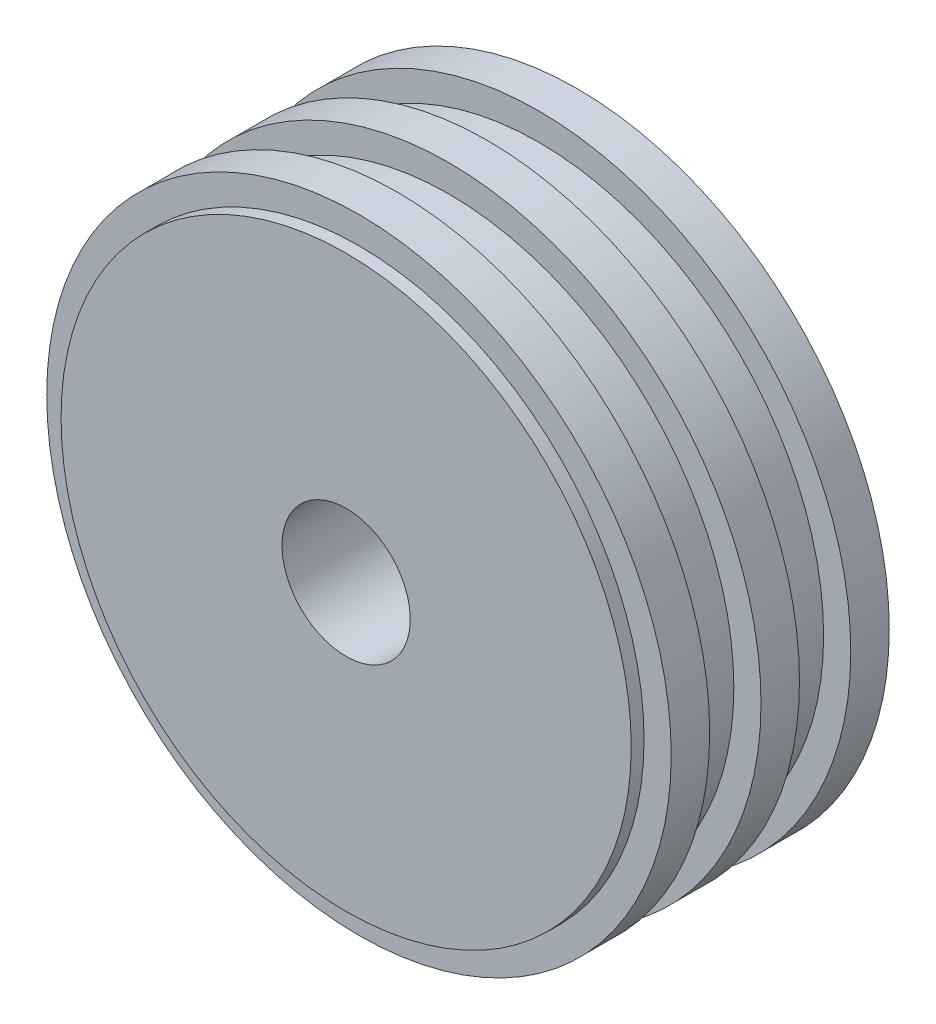
ISO-10303-21;
HEADER;
FILE_DESCRIPTION(('STEP AP214'),'2;1');
FILE_NAME('part.step','',(''),(''),'','','');
FILE_SCHEMA(('AUTOMOTIVE_DESIGN { 1 0 10303 214 1 1 1 1 }'));
ENDSEC;
DATA;
#1=APPLICATION_CONTEXT('core data for automotive mechanical design processes');
#2=APPLICATION_PROTOCOL_DEFINITION('international standard','automotive_design',2000,#1);
#3=PRODUCT_CONTEXT('',#1,'mechanical');
#4=PRODUCT('Part','Part','',(#3));
#5=PRODUCT_RELATED_PRODUCT_CATEGORY('part','',(#4));
#6=PRODUCT_DEFINITION_FORMATION('','',#4);
#7=PRODUCT_DEFINITION_CONTEXT('part definition',#1,'design');
#8=PRODUCT_DEFINITION('design','',#6,#7);
#9=PRODUCT_DEFINITION_SHAPE('','',#8);
#10=(LENGTH_UNIT() NAMED_UNIT(*) SI_UNIT(.MILLI.,.METRE.));
#11=(NAMED_UNIT(*) PLANE_ANGLE_UNIT() SI_UNIT($,.RADIAN.));
#12=(NAMED_UNIT(*) SI_UNIT($,.STERADIAN.) SOLID_ANGLE_UNIT());
#13=UNCERTAINTY_MEASURE_WITH_UNIT(LENGTH_MEASURE(1.E-05),#10,'distance_accuracy_value','');
#14=(GEOMETRIC_REPRESENTATION_CONTEXT(3) GLOBAL_UNCERTAINTY_ASSIGNED_CONTEXT((#13)) GLOBAL_UNIT_ASSIGNED_CONTEXT((#10,
#11,#12)) REPRESENTATION_CONTEXT('',''));
#15=CARTESIAN_POINT('',(0.,0.,0.));
#16=DIRECTION('',(0.,0.,1.));
#17=DIRECTION('',(1.,0.,0.));
#18=AXIS2_PLACEMENT_3D('',#15,#16,#17);
#19=CARTESIAN_POINT('',(0.,0.,57.));
#20=DIRECTION('',(0.,0.,-1.));
#21=DIRECTION('',(-1.,0.,0.));
#22=AXIS2_PLACEMENT_3D('',#19,#20,#21);
#23=CYLINDRICAL_SURFACE('',#22,66.675);
#24=CARTESIAN_POINT('',(0.,0.,24.));
#25=DIRECTION('',(0.,0.,-1.));
#26=DIRECTION('',(-1.,0.,0.));
#27=AXIS2_PLACEMENT_3D('',#24,#25,#26);
#28=CIRCLE('',#27,66.675);
#29=CARTESIAN_POINT('',(-66.675,0.,24.));
#30=VERTEX_POINT('',#29);
#31=EDGE_CURVE('E61',#30,#30,#28,.T.);
#32=CARTESIAN_POINT('',(0.,0.,12.));
#33=DIRECTION('',(0.,0.,-1.));
#34=DIRECTION('',(-1.,0.,0.));
#35=AXIS2_PLACEMENT_3D('',#32,#33,#34);
#36=CIRCLE('',#35,66.675);
#37=CARTESIAN_POINT('',(-66.675,0.,12.));
#38=VERTEX_POINT('',#37);
#39=EDGE_CURVE('E52',#38,#38,#36,.T.);
#40=CARTESIAN_POINT('',(-66.675,0.,24.));
#41=CARTESIAN_POINT('',(-66.675,0.,23.875));
#42=CARTESIAN_POINT('',(-66.675,0.,23.75));
#43=CARTESIAN_POINT('',(-66.675,0.,23.5));
#44=CARTESIAN_POINT('',(-66.675,0.,23.375));
#45=CARTESIAN_POINT('',(-66.675,0.,23.125));
#46=CARTESIAN_POINT('',(-66.675,0.,23.));
#47=CARTESIAN_POINT('',(-66.675,0.,22.75));
#48=CARTESIAN_POINT('',(-66.675,0.,22.625));
#49=CARTESIAN_POINT('',(-66.675,0.,22.375));
#50=CARTESIAN_POINT('',(-66.675,0.,22.25));
#51=CARTESIAN_POINT('',(-66.675,0.,22.));
#52=CARTESIAN_POINT('',(-66.675,0.,21.875));
#53=CARTESIAN_POINT('',(-66.675,0.,21.625));
#54=CARTESIAN_POINT('',(-66.675,0.,21.5));
#55=CARTESIAN_POINT('',(-66.675,0.,21.25));
#56=CARTESIAN_POINT('',(-66.675,0.,21.125));
#57=CARTESIAN_POINT('',(-66.675,0.,20.875));
#58=CARTESIAN_POINT('',(-66.675,0.,20.75));
#59=CARTESIAN_POINT('',(-66.675,0.,20.5));
#60=CARTESIAN_POINT('',(-66.675,0.,20.375));
#61=CARTESIAN_POINT('',(-66.675,0.,20.125));
#62=CARTESIAN_POINT('',(-66.675,0.,20.));
#63=CARTESIAN_POINT('',(-66.675,0.,19.75));
#64=CARTESIAN_POINT('',(-66.675,0.,19.625));
#65=CARTESIAN_POINT('',(-66.675,0.,19.375));
#66=CARTESIAN_POINT('',(-66.675,0.,19.25));
#67=CARTESIAN_POINT('',(-66.675,0.,19.));
#68=CARTESIAN_POINT('',(-66.675,0.,18.875));
#69=CARTESIAN_POINT('',(-66.675,0.,18.625));
#70=CARTESIAN_POINT('',(-66.675,0.,18.5));
#71=CARTESIAN_POINT('',(-66.675,0.,18.25));
#72=CARTESIAN_POINT('',(-66.675,0.,18.125));
#73=CARTESIAN_POINT('',(-66.675,0.,17.875));
#74=CARTESIAN_POINT('',(-66.675,0.,17.75));
#75=CARTESIAN_POINT('',(-66.675,0.,17.5));
#76=CARTESIAN_POINT('',(-66.675,0.,17.375));
#77=CARTESIAN_POINT('',(-66.675,0.,17.125));
#78=CARTESIAN_POINT('',(-66.675,0.,17.));
#79=CARTESIAN_POINT('',(-66.675,0.,16.75));
#80=CARTESIAN_POINT('',(-66.675,0.,16.625));
#81=CARTESIAN_POINT('',(-66.675,0.,16.375));
#82=CARTESIAN_POINT('',(-66.675,0.,16.25));
#83=CARTESIAN_POINT('',(-66.675,0.,16.));
#84=CARTESIAN_POINT('',(-66.675,0.,15.875));
#85=CARTESIAN_POINT('',(-66.675,0.,15.625));
#86=CARTESIAN_POINT('',(-66.675,0.,15.5));
#87=CARTESIAN_POINT('',(-66.675,0.,15.25));
#88=CARTESIAN_POINT('',(-66.675,0.,15.125));
#89=CARTESIAN_POINT('',(-66.675,0.,14.875));
#90=CARTESIAN_POINT('',(-66.675,0.,14.75));
#91=CARTESIAN_POINT('',(-66.675,0.,14.5));
#92=CARTESIAN_POINT('',(-66.675,0.,14.375));
#93=CARTESIAN_POINT('',(-66.675,0.,14.125));
#94=CARTESIAN_POINT('',(-66.675,0.,14.));
#95=CARTESIAN_POINT('',(-66.675,0.,13.75));
#96=CARTESIAN_POINT('',(-66.675,0.,13.625));
#97=CARTESIAN_POINT('',(-66.675,0.,13.375));
#98=CARTESIAN_POINT('',(-66.675,0.,13.25));
#99=CARTESIAN_POINT('',(-66.675,0.,13.));
#100=CARTESIAN_POINT('',(-66.675,0.,12.875));
#101=CARTESIAN_POINT('',(-66.675,0.,12.625));
#102=CARTESIAN_POINT('',(-66.675,0.,12.5));
#103=CARTESIAN_POINT('',(-66.675,0.,12.25));
#104=CARTESIAN_POINT('',(-66.675,0.,12.125));
#105=CARTESIAN_POINT('',(-66.675,0.,12.));
#106=B_SPLINE_CURVE_WITH_KNOTS('',3,(#40,#41,#42,#43,#44,#45,#46,#47,#48,#49,#50,#51,#52,#53,
#54,#55,#56,#57,#58,#59,#60,#61,#62,#63,#64,#65,#66,#67,#68,#69,#70,#71,#72,#73,#74,#75,#76,#77,
#78,#79,#80,#81,#82,#83,#84,#85,#86,#87,#88,#89,#90,#91,#92,#93,#94,#95,#96,#97,#98,#99,#100,
#101,#102,#103,#104,#105),.UNSPECIFIED.,.F.,.F.,(4,2,2,2,2,2,2,2,2,2,2,2,2,2,2,2,2,2,2,2,2,2,2,
2,2,2,2,2,2,2,2,2,4),(0.,0.375,0.750000000000001,1.125,1.5,1.875,2.25,2.625,3.,3.375,3.75,4.125,
4.5,4.875,5.25,5.625,6.,6.375,6.75,7.125,7.5,7.875,8.24999999999999,8.62499999999999,
8.99999999999999,9.37499999999999,9.74999999999999,10.125,10.5,10.875,11.25,11.625,12.),.UNSPECIFIED.);
#107=EDGE_CURVE('BSEAM39',#30,#38,#106,.T.);
#108=ORIENTED_EDGE('',*,*,#31,.T.);
#109=ORIENTED_EDGE('',*,*,#39,.F.);
#110=ORIENTED_EDGE('',*,*,#107,.T.);
#111=ORIENTED_EDGE('',*,*,#107,.F.);
#112=EDGE_LOOP('',(#108,#110,#109,#111));
#113=FACE_BOUND('',#112,.T.);
#114=ADVANCED_FACE('F39',(#113),#23,.T.);
#115=CARTESIAN_POINT('',(0.,0.,12.));
#116=DIRECTION('',(0.,0.,-1.));
#117=DIRECTION('',(-1.,0.,0.));
#118=AXIS2_PLACEMENT_3D('',#115,#116,#117);
#119=CYLINDRICAL_SURFACE('',#118,73.025);
#120=CARTESIAN_POINT('',(0.,0.,12.));
#121=DIRECTION('',(0.,0.,-1.));
#122=DIRECTION('',(-1.,0.,0.));
#123=AXIS2_PLACEMENT_3D('',#120,#121,#122);
#124=CIRCLE('',#123,73.025);
#125=CARTESIAN_POINT('',(-73.025,0.,12.));
#126=VERTEX_POINT('',#125);
#127=EDGE_CURVE('E68',#126,#126,#124,.T.);
#128=ORIENTED_EDGE('',*,*,#127,.T.);
#129=EDGE_LOOP('',(#128));
#130=FACE_BOUND('',#129,.T.);
#131=CARTESIAN_POINT('',(0.,0.,3.));
#132=DIRECTION('',(0.,0.,-1.));
#133=DIRECTION('',(-1.,0.,0.));
#134=AXIS2_PLACEMENT_3D('',#131,#132,#133);
#135=CIRCLE('',#134,73.025);
#136=CARTESIAN_POINT('',(-73.025,0.,3.));
#137=VERTEX_POINT('',#136);
#138=EDGE_CURVE('E66',#137,#137,#135,.T.);
#139=ORIENTED_EDGE('',*,*,#138,.F.);
#140=EDGE_LOOP('',(#139));
#141=FACE_BOUND('',#140,.T.);
#142=ADVANCED_FACE('F114',(#130,#141),#119,.T.);
#143=CARTESIAN_POINT('',(0.,0.,12.));
#144=DIRECTION('',(0.,0.,-1.));
#145=DIRECTION('',(-1.,0.,0.));
#146=AXIS2_PLACEMENT_3D('',#143,#144,#145);
#147=PLANE('',#146);
#148=ORIENTED_EDGE('',*,*,#39,.T.);
#149=EDGE_LOOP('',(#148));
#150=FACE_BOUND('',#149,.T.);
#151=ORIENTED_EDGE('',*,*,#127,.F.);
#152=EDGE_LOOP('',(#151));
#153=FACE_BOUND('',#152,.T.);
#154=ADVANCED_FACE('F119',(#150,#153),#147,.F.);
#155=CARTESIAN_POINT('',(0.,0.,3.));
#156=DIRECTION('',(0.,0.,-1.));
#157=DIRECTION('',(-1.,0.,0.));
#158=AXIS2_PLACEMENT_3D('',#155,#156,#157);
#159=PLANE('',#158);
#160=CARTESIAN_POINT('',(0.,0.,3.));
#161=DIRECTION('',(0.,0.,-1.));
#162=DIRECTION('',(-1.,0.,0.));
#163=AXIS2_PLACEMENT_3D('',#160,#161,#162);
#164=CIRCLE('',#163,66.675);
#165=CARTESIAN_POINT('',(-66.675,0.,3.));
#166=VERTEX_POINT('',#165);
#167=EDGE_CURVE('E71',#166,#166,#164,.T.);
#168=ORIENTED_EDGE('',*,*,#167,.F.);
#169=EDGE_LOOP('',(#168));
#170=FACE_BOUND('',#169,.T.);
#171=ORIENTED_EDGE('',*,*,#138,.T.);
#172=EDGE_LOOP('',(#171));
#173=FACE_BOUND('',#172,.T.);
#174=ADVANCED_FACE('F124',(#170,#173),#159,.T.);
#175=CARTESIAN_POINT('',(0.,0.,0.));
#176=DIRECTION('',(0.,0.,1.));
#177=DIRECTION('',(1.,0.,0.));
#178=AXIS2_PLACEMENT_3D('',#175,#176,#177);
#179=CIRCLE('',#178,66.675);
#180=CARTESIAN_POINT('',(-66.675,0.,0.));
#181=VERTEX_POINT('',#180);
#182=EDGE_CURVE('E43',#181,#181,#179,.T.);
#183=CARTESIAN_POINT('',(-66.675,0.,3.));
#184=CARTESIAN_POINT('',(-66.675,0.,2.96875));
#185=CARTESIAN_POINT('',(-66.675,0.,2.9375));
#186=CARTESIAN_POINT('',(-66.675,0.,2.875));
#187=CARTESIAN_POINT('',(-66.675,0.,2.84375));
#188=CARTESIAN_POINT('',(-66.675,0.,2.78125));
#189=CARTESIAN_POINT('',(-66.675,0.,2.75));
#190=CARTESIAN_POINT('',(-66.675,0.,2.6875));
#191=CARTESIAN_POINT('',(-66.675,0.,2.65625));
#192=CARTESIAN_POINT('',(-66.675,0.,2.59375));
#193=CARTESIAN_POINT('',(-66.675,0.,2.5625));
#194=CARTESIAN_POINT('',(-66.675,0.,2.5));
#195=CARTESIAN_POINT('',(-66.675,0.,2.46875));
#196=CARTESIAN_POINT('',(-66.675,0.,2.40625));
#197=CARTESIAN_POINT('',(-66.675,0.,2.375));
#198=CARTESIAN_POINT('',(-66.675,0.,2.3125));
#199=CARTESIAN_POINT('',(-66.675,0.,2.28125));
#200=CARTESIAN_POINT('',(-66.675,0.,2.21875));
#201=CARTESIAN_POINT('',(-66.675,0.,2.1875));
#202=CARTESIAN_POINT('',(-66.675,0.,2.125));
#203=CARTESIAN_POINT('',(-66.675,0.,2.09375));
#204=CARTESIAN_POINT('',(-66.675,0.,2.03125));
#205=CARTESIAN_POINT('',(-66.675,0.,2.));
#206=CARTESIAN_POINT('',(-66.675,0.,1.9375));
#207=CARTESIAN_POINT('',(-66.675,0.,1.90625));
#208=CARTESIAN_POINT('',(-66.675,0.,1.84375));
#209=CARTESIAN_POINT('',(-66.675,0.,1.8125));
#210=CARTESIAN_POINT('',(-66.675,0.,1.75));
#211=CARTESIAN_POINT('',(-66.675,0.,1.71875));
#212=CARTESIAN_POINT('',(-66.675,0.,1.65625));
#213=CARTESIAN_POINT('',(-66.675,0.,1.625));
#214=CARTESIAN_POINT('',(-66.675,0.,1.5625));
#215=CARTESIAN_POINT('',(-66.675,0.,1.53125));
#216=CARTESIAN_POINT('',(-66.675,0.,1.46875));
#217=CARTESIAN_POINT('',(-66.675,0.,1.4375));
#218=CARTESIAN_POINT('',(-66.675,0.,1.375));
#219=CARTESIAN_POINT('',(-66.675,0.,1.34375));
#220=CARTESIAN_POINT('',(-66.675,0.,1.28125));
#221=CARTESIAN_POINT('',(-66.675,0.,1.25));
#222=CARTESIAN_POINT('',(-66.675,0.,1.1875));
#223=CARTESIAN_POINT('',(-66.675,0.,1.15625));
#224=CARTESIAN_POINT('',(-66.675,0.,1.09375));
#225=CARTESIAN_POINT('',(-66.675,0.,1.0625));
#226=CARTESIAN_POINT('',(-66.675,0.,0.999999999999999));
#227=CARTESIAN_POINT('',(-66.675,0.,0.96875));
#228=CARTESIAN_POINT('',(-66.675,0.,0.906250000000002));
#229=CARTESIAN_POINT('',(-66.675,0.,0.875000000000003));
#230=CARTESIAN_POINT('',(-66.675,0.,0.812500000000003));
#231=CARTESIAN_POINT('',(-66.675,0.,0.781250000000002));
#232=CARTESIAN_POINT('',(-66.675,0.,0.718749999999999));
#233=CARTESIAN_POINT('',(-66.675,0.,0.687499999999998));
#234=CARTESIAN_POINT('',(-66.675,0.,0.624999999999998));
#235=CARTESIAN_POINT('',(-66.675,0.,0.593749999999999));
#236=CARTESIAN_POINT('',(-66.675,0.,0.531250000000002));
#237=CARTESIAN_POINT('',(-66.675,0.,0.500000000000003));
#238=CARTESIAN_POINT('',(-66.675,0.,0.437500000000003));
#239=CARTESIAN_POINT('',(-66.675,0.,0.406250000000002));
#240=CARTESIAN_POINT('',(-66.675,0.,0.343749999999999));
#241=CARTESIAN_POINT('',(-66.675,0.,0.312499999999998));
#242=CARTESIAN_POINT('',(-66.675,0.,0.249999999999998));
#243=CARTESIAN_POINT('',(-66.675,0.,0.218749999999999));
#244=CARTESIAN_POINT('',(-66.675,0.,0.156250000000001));
#245=CARTESIAN_POINT('',(-66.675,0.,0.125000000000002));
#246=CARTESIAN_POINT('',(-66.675,0.,0.0625000000000024));
#247=CARTESIAN_POINT('',(-66.675,0.,0.0312500000000012));
#248=CARTESIAN_POINT('',(-66.675,0.,0.));
#249=B_SPLINE_CURVE_WITH_KNOTS('',3,(#183,#184,#185,#186,#187,#188,#189,#190,#191,#192,#193,
#194,#195,#196,#197,#198,#199,#200,#201,#202,#203,#204,#205,#206,#207,#208,#209,#210,#211,#212,
#213,#214,#215,#216,#217,#218,#219,#220,#221,#222,#223,#224,#225,#226,#227,#228,#229,#230,#231,
#232,#233,#234,#235,#236,#237,#238,#239,#240,#241,#242,#243,#244,#245,#246,#247,#248),
.UNSPECIFIED.,.F.,.F.,(4,2,2,2,2,2,2,2,2,2,2,2,2,2,2,2,2,2,2,2,2,2,2,2,2,2,2,2,2,2,2,2,4),(0.,
0.0937500000000036,0.1875,0.281249999999997,0.375,0.468750000000004,0.5625,0.656249999999997,
0.750000000000001,0.843750000000004,0.937500000000001,1.03125,1.125,1.21875,1.3125,1.40625,1.5,
1.59375,1.6875,1.78125,1.875,1.96875000000001,2.0625,2.15625,2.25,2.34375000000001,2.4375,
2.53125,2.625,2.71875000000001,2.8125,2.90625,3.),.UNSPECIFIED.);
#250=EDGE_CURVE('BSEAM41',#166,#181,#249,.T.);
#251=ORIENTED_EDGE('',*,*,#167,.T.);
#252=ORIENTED_EDGE('',*,*,#182,.T.);
#253=ORIENTED_EDGE('',*,*,#250,.T.);
#254=ORIENTED_EDGE('',*,*,#250,.F.);
#255=EDGE_LOOP('',(#251,#253,#252,#254));
#256=FACE_BOUND('',#255,.T.);
#257=ADVANCED_FACE('F41',(#256),#23,.T.);
#258=CARTESIAN_POINT('',(0.,0.,0.));
#259=DIRECTION('',(0.,0.,1.));
#260=DIRECTION('',(1.,0.,0.));
#261=AXIS2_PLACEMENT_3D('',#258,#259,#260);
#262=PLANE('',#261);
#263=ORIENTED_EDGE('',*,*,#182,.F.);
#264=EDGE_LOOP('',(#263));
#265=FACE_BOUND('',#264,.T.);
#266=CARTESIAN_POINT('',(0.,0.,0.));
#267=DIRECTION('',(0.,0.,1.));
#268=DIRECTION('',(1.,0.,0.));
#269=AXIS2_PLACEMENT_3D('',#266,#267,#268);
#270=CIRCLE('',#269,15.);
#271=CARTESIAN_POINT('',(-15.,0.,0.));
#272=VERTEX_POINT('',#271);
#273=EDGE_CURVE('E76',#272,#272,#270,.T.);
#274=ORIENTED_EDGE('',*,*,#273,.T.);
#275=EDGE_LOOP('',(#274));
#276=FACE_BOUND('',#275,.T.);
#277=ADVANCED_FACE('F91',(#265,#276),#262,.F.);
#278=CARTESIAN_POINT('',(0.,0.,57.));
#279=DIRECTION('',(0.,0.,-1.));
#280=DIRECTION('',(-1.,0.,0.));
#281=AXIS2_PLACEMENT_3D('',#278,#279,#280);
#282=CYLINDRICAL_SURFACE('',#281,15.);
#283=CARTESIAN_POINT('',(0.,0.,57.));
#284=DIRECTION('',(0.,0.,1.));
#285=DIRECTION('',(1.,0.,0.));
#286=AXIS2_PLACEMENT_3D('',#283,#284,#285);
#287=CIRCLE('',#286,15.);
#288=CARTESIAN_POINT('',(-15.,0.,57.));
#289=VERTEX_POINT('',#288);
#290=EDGE_CURVE('E80',#289,#289,#287,.T.);
#291=CARTESIAN_POINT('',(-15.,0.,0.));
#292=CARTESIAN_POINT('',(-15.,0.,0.593749999999999));
#293=CARTESIAN_POINT('',(-15.,0.,1.1875));
#294=CARTESIAN_POINT('',(-15.,0.,2.375));
#295=CARTESIAN_POINT('',(-15.,0.,2.96875));
#296=CARTESIAN_POINT('',(-15.,0.,4.15625));
#297=CARTESIAN_POINT('',(-15.,0.,4.75));
#298=CARTESIAN_POINT('',(-15.,0.,5.9375));
#299=CARTESIAN_POINT('',(-15.,0.,6.53125));
#300=CARTESIAN_POINT('',(-15.,0.,7.71875));
#301=CARTESIAN_POINT('',(-15.,0.,8.3125));
#302=CARTESIAN_POINT('',(-15.,0.,9.5));
#303=CARTESIAN_POINT('',(-15.,0.,10.09375));
#304=CARTESIAN_POINT('',(-15.,0.,11.28125));
#305=CARTESIAN_POINT('',(-15.,0.,11.875));
#306=CARTESIAN_POINT('',(-15.,0.,13.0625));
#307=CARTESIAN_POINT('',(-15.,0.,13.65625));
#308=CARTESIAN_POINT('',(-15.,0.,14.84375));
#309=CARTESIAN_POINT('',(-15.,0.,15.4375));
#310=CARTESIAN_POINT('',(-15.,0.,16.625));
#311=CARTESIAN_POINT('',(-15.,0.,17.21875));
#312=CARTESIAN_POINT('',(-15.,0.,18.40625));
#313=CARTESIAN_POINT('',(-15.,0.,19.));
#314=CARTESIAN_POINT('',(-15.,0.,20.1875));
#315=CARTESIAN_POINT('',(-15.,0.,20.78125));
#316=CARTESIAN_POINT('',(-15.,0.,21.96875));
#317=CARTESIAN_POINT('',(-15.,0.,22.5625));
#318=CARTESIAN_POINT('',(-15.,0.,23.75));
#319=CARTESIAN_POINT('',(-15.,0.,24.34375));
#320=CARTESIAN_POINT('',(-15.,0.,25.53125));
#321=CARTESIAN_POINT('',(-15.,0.,26.125));
#322=CARTESIAN_POINT('',(-15.,0.,27.3125));
#323=CARTESIAN_POINT('',(-15.,0.,27.90625));
#324=CARTESIAN_POINT('',(-15.,0.,29.09375));
#325=CARTESIAN_POINT('',(-15.,0.,29.6875));
#326=CARTESIAN_POINT('',(-15.,0.,30.875));
#327=CARTESIAN_POINT('',(-15.,0.,31.46875));
#328=CARTESIAN_POINT('',(-15.,0.,32.65625));
#329=CARTESIAN_POINT('',(-15.,0.,33.25));
#330=CARTESIAN_POINT('',(-15.,0.,34.4375));
#331=CARTESIAN_POINT('',(-15.,0.,35.03125));
#332=CARTESIAN_POINT('',(-15.,0.,36.21875));
#333=CARTESIAN_POINT('',(-15.,0.,36.8125));
#334=CARTESIAN_POINT('',(-15.,0.,38.));
#335=CARTESIAN_POINT('',(-15.,0.,38.59375));
#336=CARTESIAN_POINT('',(-15.,0.,39.78125));
#337=CARTESIAN_POINT('',(-15.,0.,40.375));
#338=CARTESIAN_POINT('',(-15.,0.,41.5625));
#339=CARTESIAN_POINT('',(-15.,0.,42.15625));
#340=CARTESIAN_POINT('',(-15.,0.,43.34375));
#341=CARTESIAN_POINT('',(-15.,0.,43.9375));
#342=CARTESIAN_POINT('',(-15.,0.,45.125));
#343=CARTESIAN_POINT('',(-15.,0.,45.71875));
#344=CARTESIAN_POINT('',(-15.,0.,46.90625));
#345=CARTESIAN_POINT('',(-15.,0.,47.5));
#346=CARTESIAN_POINT('',(-15.,0.,48.6875));
#347=CARTESIAN_POINT('',(-15.,0.,49.28125));
#348=CARTESIAN_POINT('',(-15.,0.,50.46875));
#349=CARTESIAN_POINT('',(-15.,0.,51.0625));
#350=CARTESIAN_POINT('',(-15.,0.,52.25));
#351=CARTESIAN_POINT('',(-15.,0.,52.84375));
#352=CARTESIAN_POINT('',(-15.,0.,54.03125));
#353=CARTESIAN_POINT('',(-15.,0.,54.625));
#354=CARTESIAN_POINT('',(-15.,0.,55.8125));
#355=CARTESIAN_POINT('',(-15.,0.,56.40625));
#356=CARTESIAN_POINT('',(-15.,0.,57.));
#357=B_SPLINE_CURVE_WITH_KNOTS('',3,(#291,#292,#293,#294,#295,#296,#297,#298,#299,#300,#301,
#302,#303,#304,#305,#306,#307,#308,#309,#310,#311,#312,#313,#314,#315,#316,#317,#318,#319,#320,
#321,#322,#323,#324,#325,#326,#327,#328,#329,#330,#331,#332,#333,#334,#335,#336,#337,#338,#339,
#340,#341,#342,#343,#344,#345,#346,#347,#348,#349,#350,#351,#352,#353,#354,#355,#356),
.UNSPECIFIED.,.F.,.F.,(4,2,2,2,2,2,2,2,2,2,2,2,2,2,2,2,2,2,2,2,2,2,2,2,2,2,2,2,2,2,2,2,4),(0.,
1.78125,3.5625,5.34375,7.125,8.90625,10.6875,12.46875,14.25,16.03125,17.8125,19.59375,21.375,
23.15625,24.9375,26.71875,28.5,30.28125,32.0625,33.84375,35.625,37.40625,39.1875,40.96875,42.75,
44.53125,46.3125,48.09375,49.875,51.65625,53.4375,55.21875,57.),.UNSPECIFIED.);
#358=EDGE_CURVE('BSEAM94',#272,#289,#357,.T.);
#359=ORIENTED_EDGE('',*,*,#273,.F.);
#360=ORIENTED_EDGE('',*,*,#290,.T.);
#361=ORIENTED_EDGE('',*,*,#358,.T.);
#362=ORIENTED_EDGE('',*,*,#358,.F.);
#363=EDGE_LOOP('',(#359,#361,#360,#362));
#364=FACE_BOUND('',#363,.T.);
#365=ADVANCED_FACE('F94',(#364),#282,.F.);
#366=CARTESIAN_POINT('',(0.,0.,33.));
#367=DIRECTION('',(0.,0.,-1.));
#368=DIRECTION('',(-1.,0.,0.));
#369=AXIS2_PLACEMENT_3D('',#366,#367,#368);
#370=CYLINDRICAL_SURFACE('',#369,73.025);
#371=CARTESIAN_POINT('',(0.,0.,33.));
#372=DIRECTION('',(0.,0.,-1.));
#373=DIRECTION('',(-1.,0.,0.));
#374=AXIS2_PLACEMENT_3D('',#371,#372,#373);
#375=CIRCLE('',#374,73.025);
#376=CARTESIAN_POINT('',(-73.025,0.,33.));
#377=VERTEX_POINT('',#376);
#378=EDGE_CURVE('E58',#377,#377,#375,.T.);
#379=ORIENTED_EDGE('',*,*,#378,.T.);
#380=EDGE_LOOP('',(#379));
#381=FACE_BOUND('',#380,.T.);
#382=CARTESIAN_POINT('',(0.,0.,24.));
#383=DIRECTION('',(0.,0.,-1.));
#384=DIRECTION('',(-1.,0.,0.));
#385=AXIS2_PLACEMENT_3D('',#382,#383,#384);
#386=CIRCLE('',#385,73.025);
#387=CARTESIAN_POINT('',(-73.025,0.,24.));
#388=VERTEX_POINT('',#387);
#389=EDGE_CURVE('E62',#388,#388,#386,.T.);
#390=ORIENTED_EDGE('',*,*,#389,.F.);
#391=EDGE_LOOP('',(#390));
#392=FACE_BOUND('',#391,.T.);
#393=ADVANCED_FACE('F99',(#381,#392),#370,.T.);
#394=CARTESIAN_POINT('',(0.,0.,33.));
#395=DIRECTION('',(0.,0.,-1.));
#396=DIRECTION('',(-1.,0.,0.));
#397=AXIS2_PLACEMENT_3D('',#394,#395,#396);
#398=PLANE('',#397);
#399=CARTESIAN_POINT('',(0.,0.,33.));
#400=DIRECTION('',(0.,0.,-1.));
#401=DIRECTION('',(-1.,0.,0.));
#402=AXIS2_PLACEMENT_3D('',#399,#400,#401);
#403=CIRCLE('',#402,66.675);
#404=CARTESIAN_POINT('',(-66.675,0.,33.));
#405=VERTEX_POINT('',#404);
#406=EDGE_CURVE('E47',#405,#405,#403,.T.);
#407=ORIENTED_EDGE('',*,*,#406,.T.);
#408=EDGE_LOOP('',(#407));
#409=FACE_BOUND('',#408,.T.);
#410=ORIENTED_EDGE('',*,*,#378,.F.);
#411=EDGE_LOOP('',(#410));
#412=FACE_BOUND('',#411,.T.);
#413=ADVANCED_FACE('F137',(#409,#412),#398,.F.);
#414=CARTESIAN_POINT('',(0.,0.,24.));
#415=DIRECTION('',(0.,0.,-1.));
#416=DIRECTION('',(-1.,0.,0.));
#417=AXIS2_PLACEMENT_3D('',#414,#415,#416);
#418=PLANE('',#417);
#419=ORIENTED_EDGE('',*,*,#31,.F.);
#420=EDGE_LOOP('',(#419));
#421=FACE_BOUND('',#420,.T.);
#422=ORIENTED_EDGE('',*,*,#389,.T.);
#423=EDGE_LOOP('',(#422));
#424=FACE_BOUND('',#423,.T.);
#425=ADVANCED_FACE('F128',(#421,#424),#418,.T.);
#426=CARTESIAN_POINT('',(0.,0.,45.));
#427=DIRECTION('',(0.,0.,-1.));
#428=DIRECTION('',(-1.,0.,0.));
#429=AXIS2_PLACEMENT_3D('',#426,#427,#428);
#430=CIRCLE('',#429,66.675);
#431=CARTESIAN_POINT('',(-66.675,0.,45.));
#432=VERTEX_POINT('',#431);
#433=EDGE_CURVE('E56',#432,#432,#430,.T.);
#434=CARTESIAN_POINT('',(-66.675,0.,45.));
#435=CARTESIAN_POINT('',(-66.675,0.,44.875));
#436=CARTESIAN_POINT('',(-66.675,0.,44.75));
#437=CARTESIAN_POINT('',(-66.675,0.,44.5));
#438=CARTESIAN_POINT('',(-66.675,0.,44.375));
#439=CARTESIAN_POINT('',(-66.675,0.,44.125));
#440=CARTESIAN_POINT('',(-66.675,0.,44.));
#441=CARTESIAN_POINT('',(-66.675,0.,43.75));
#442=CARTESIAN_POINT('',(-66.675,0.,43.625));
#443=CARTESIAN_POINT('',(-66.675,0.,43.375));
#444=CARTESIAN_POINT('',(-66.675,0.,43.25));
#445=CARTESIAN_POINT('',(-66.675,0.,43.));
#446=CARTESIAN_POINT('',(-66.675,0.,42.875));
#447=CARTESIAN_POINT('',(-66.675,0.,42.625));
#448=CARTESIAN_POINT('',(-66.675,0.,42.5));
#449=CARTESIAN_POINT('',(-66.675,0.,42.25));
#450=CARTESIAN_POINT('',(-66.675,0.,42.125));
#451=CARTESIAN_POINT('',(-66.675,0.,41.875));
#452=CARTESIAN_POINT('',(-66.675,0.,41.75));
#453=CARTESIAN_POINT('',(-66.675,0.,41.5));
#454=CARTESIAN_POINT('',(-66.675,0.,41.375));
#455=CARTESIAN_POINT('',(-66.675,0.,41.125));
#456=CARTESIAN_POINT('',(-66.675,0.,41.));
#457=CARTESIAN_POINT('',(-66.675,0.,40.75));
#458=CARTESIAN_POINT('',(-66.675,0.,40.625));
#459=CARTESIAN_POINT('',(-66.675,0.,40.375));
#460=CARTESIAN_POINT('',(-66.675,0.,40.25));
#461=CARTESIAN_POINT('',(-66.675,0.,40.));
#462=CARTESIAN_POINT('',(-66.675,0.,39.875));
#463=CARTESIAN_POINT('',(-66.675,0.,39.625));
#464=CARTESIAN_POINT('',(-66.675,0.,39.5));
#465=CARTESIAN_POINT('',(-66.675,0.,39.25));
#466=CARTESIAN_POINT('',(-66.675,0.,39.125));
#467=CARTESIAN_POINT('',(-66.675,0.,38.875));
#468=CARTESIAN_POINT('',(-66.675,0.,38.75));
#469=CARTESIAN_POINT('',(-66.675,0.,38.5));
#470=CARTESIAN_POINT('',(-66.675,0.,38.375));
#471=CARTESIAN_POINT('',(-66.675,0.,38.125));
#472=CARTESIAN_POINT('',(-66.675,0.,38.));
#473=CARTESIAN_POINT('',(-66.675,0.,37.75));
#474=CARTESIAN_POINT('',(-66.675,0.,37.625));
#475=CARTESIAN_POINT('',(-66.675,0.,37.375));
#476=CARTESIAN_POINT('',(-66.675,0.,37.25));
#477=CARTESIAN_POINT('',(-66.675,0.,37.));
#478=CARTESIAN_POINT('',(-66.675,0.,36.875));
#479=CARTESIAN_POINT('',(-66.675,0.,36.625));
#480=CARTESIAN_POINT('',(-66.675,0.,36.5));
#481=CARTESIAN_POINT('',(-66.675,0.,36.25));
#482=CARTESIAN_POINT('',(-66.675,0.,36.125));
#483=CARTESIAN_POINT('',(-66.675,0.,35.875));
#484=CARTESIAN_POINT('',(-66.675,0.,35.75));
#485=CARTESIAN_POINT('',(-66.675,0.,35.5));
#486=CARTESIAN_POINT('',(-66.675,0.,35.375));
#487=CARTESIAN_POINT('',(-66.675,0.,35.125));
#488=CARTESIAN_POINT('',(-66.675,0.,35.));
#489=CARTESIAN_POINT('',(-66.675,0.,34.75));
#490=CARTESIAN_POINT('',(-66.675,0.,34.625));
#491=CARTESIAN_POINT('',(-66.675,0.,34.375));
#492=CARTESIAN_POINT('',(-66.675,0.,34.25));
#493=CARTESIAN_POINT('',(-66.675,0.,34.));
#494=CARTESIAN_POINT('',(-66.675,0.,33.875));
#495=CARTESIAN_POINT('',(-66.675,0.,33.625));
#496=CARTESIAN_POINT('',(-66.675,0.,33.5));
#497=CARTESIAN_POINT('',(-66.675,0.,33.25));
#498=CARTESIAN_POINT('',(-66.675,0.,33.125));
#499=CARTESIAN_POINT('',(-66.675,0.,33.));
#500=B_SPLINE_CURVE_WITH_KNOTS('',3,(#434,#435,#436,#437,#438,#439,#440,#441,#442,#443,#444,
#445,#446,#447,#448,#449,#450,#451,#452,#453,#454,#455,#456,#457,#458,#459,#460,#461,#462,#463,
#464,#465,#466,#467,#468,#469,#470,#471,#472,#473,#474,#475,#476,#477,#478,#479,#480,#481,#482,
#483,#484,#485,#486,#487,#488,#489,#490,#491,#492,#493,#494,#495,#496,#497,#498,#499),
.UNSPECIFIED.,.F.,.F.,(4,2,2,2,2,2,2,2,2,2,2,2,2,2,2,2,2,2,2,2,2,2,2,2,2,2,2,2,2,2,2,2,4),(0.,
0.375,0.750000000000001,1.125,1.5,1.87499999999999,2.25,2.625,3.,3.375,3.75,4.125,4.5,4.875,
5.25,5.625,6.,6.375,6.75,7.125,7.5,7.875,8.25,8.625,9.,9.375,9.75,10.125,10.5,10.875,11.25,
11.625,12.),.UNSPECIFIED.);
#501=EDGE_CURVE('BSEAM112',#432,#405,#500,.T.);
#502=ORIENTED_EDGE('',*,*,#433,.T.);
#503=ORIENTED_EDGE('',*,*,#406,.F.);
#504=ORIENTED_EDGE('',*,*,#501,.T.);
#505=ORIENTED_EDGE('',*,*,#501,.F.);
#506=EDGE_LOOP('',(#502,#504,#503,#505));
#507=FACE_BOUND('',#506,.T.);
#508=ADVANCED_FACE('F112',(#507),#23,.T.);
#509=CARTESIAN_POINT('',(0.,0.,54.));
#510=DIRECTION('',(0.,0.,-1.));
#511=DIRECTION('',(-1.,0.,0.));
#512=AXIS2_PLACEMENT_3D('',#509,#510,#511);
#513=CYLINDRICAL_SURFACE('',#512,73.025);
#514=CARTESIAN_POINT('',(0.,0.,54.));
#515=DIRECTION('',(0.,0.,-1.));
#516=DIRECTION('',(-1.,0.,0.));
#517=AXIS2_PLACEMENT_3D('',#514,#515,#516);
#518=CIRCLE('',#517,73.025);
#519=CARTESIAN_POINT('',(-73.025,0.,54.));
#520=VERTEX_POINT('',#519);
#521=EDGE_CURVE('E266',#520,#520,#518,.T.);
#522=ORIENTED_EDGE('',*,*,#521,.T.);
#523=EDGE_LOOP('',(#522));
#524=FACE_BOUND('',#523,.T.);
#525=CARTESIAN_POINT('',(0.,0.,45.));
#526=DIRECTION('',(0.,0.,-1.));
#527=DIRECTION('',(-1.,0.,0.));
#528=AXIS2_PLACEMENT_3D('',#525,#526,#527);
#529=CIRCLE('',#528,73.025);
#530=CARTESIAN_POINT('',(-73.025,0.,45.));
#531=VERTEX_POINT('',#530);
#532=EDGE_CURVE('E267',#531,#531,#529,.T.);
#533=ORIENTED_EDGE('',*,*,#532,.F.);
#534=EDGE_LOOP('',(#533));
#535=FACE_BOUND('',#534,.T.);
#536=ADVANCED_FACE('F127',(#524,#535),#513,.T.);
#537=CARTESIAN_POINT('',(0.,0.,54.));
#538=DIRECTION('',(0.,0.,-1.));
#539=DIRECTION('',(-1.,0.,0.));
#540=AXIS2_PLACEMENT_3D('',#537,#538,#539);
#541=PLANE('',#540);
#542=CARTESIAN_POINT('',(0.,0.,54.));
#543=DIRECTION('',(0.,0.,-1.));
#544=DIRECTION('',(-1.,0.,0.));
#545=AXIS2_PLACEMENT_3D('',#542,#543,#544);
#546=CIRCLE('',#545,66.675);
#547=CARTESIAN_POINT('',(-66.675,0.,54.));
#548=VERTEX_POINT('',#547);
#549=EDGE_CURVE('E11',#548,#548,#546,.T.);
#550=ORIENTED_EDGE('',*,*,#549,.T.);
#551=EDGE_LOOP('',(#550));
#552=FACE_BOUND('',#551,.T.);
#553=ORIENTED_EDGE('',*,*,#521,.F.);
#554=EDGE_LOOP('',(#553));
#555=FACE_BOUND('',#554,.T.);
#556=ADVANCED_FACE('F134',(#552,#555),#541,.F.);
#557=CARTESIAN_POINT('',(0.,0.,45.));
#558=DIRECTION('',(0.,0.,-1.));
#559=DIRECTION('',(-1.,0.,0.));
#560=AXIS2_PLACEMENT_3D('',#557,#558,#559);
#561=PLANE('',#560);
#562=ORIENTED_EDGE('',*,*,#433,.F.);
#563=EDGE_LOOP('',(#562));
#564=FACE_BOUND('',#563,.T.);
#565=ORIENTED_EDGE('',*,*,#532,.T.);
#566=EDGE_LOOP('',(#565));
#567=FACE_BOUND('',#566,.T.);
#568=ADVANCED_FACE('F110',(#564,#567),#561,.T.);
#569=CARTESIAN_POINT('',(0.,0.,57.));
#570=DIRECTION('',(0.,0.,1.));
#571=DIRECTION('',(1.,0.,0.));
#572=AXIS2_PLACEMENT_3D('',#569,#570,#571);
#573=CIRCLE('',#572,66.675);
#574=CARTESIAN_POINT('',(-66.675,0.,57.));
#575=VERTEX_POINT('',#574);
#576=EDGE_CURVE('E79',#575,#575,#573,.T.);
#577=CARTESIAN_POINT('',(-66.675,0.,57.));
#578=CARTESIAN_POINT('',(-66.675,0.,56.96875));
#579=CARTESIAN_POINT('',(-66.675,0.,56.9375));
#580=CARTESIAN_POINT('',(-66.675,0.,56.875));
#581=CARTESIAN_POINT('',(-66.675,0.,56.84375));
#582=CARTESIAN_POINT('',(-66.675,0.,56.78125));
#583=CARTESIAN_POINT('',(-66.675,0.,56.75));
#584=CARTESIAN_POINT('',(-66.675,0.,56.6875));
#585=CARTESIAN_POINT('',(-66.675,0.,56.65625));
#586=CARTESIAN_POINT('',(-66.675,0.,56.59375));
#587=CARTESIAN_POINT('',(-66.675,0.,56.5625));
#588=CARTESIAN_POINT('',(-66.675,0.,56.5));
#589=CARTESIAN_POINT('',(-66.675,0.,56.46875));
#590=CARTESIAN_POINT('',(-66.675,0.,56.40625));
#591=CARTESIAN_POINT('',(-66.675,0.,56.375));
#592=CARTESIAN_POINT('',(-66.675,0.,56.3125));
#593=CARTESIAN_POINT('',(-66.675,0.,56.28125));
#594=CARTESIAN_POINT('',(-66.675,0.,56.21875));
#595=CARTESIAN_POINT('',(-66.675,0.,56.1875));
#596=CARTESIAN_POINT('',(-66.675,0.,56.125));
#597=CARTESIAN_POINT('',(-66.675,0.,56.09375));
#598=CARTESIAN_POINT('',(-66.675,0.,56.03125));
#599=CARTESIAN_POINT('',(-66.675,0.,56.));
#600=CARTESIAN_POINT('',(-66.675,0.,55.9375));
#601=CARTESIAN_POINT('',(-66.675,0.,55.90625));
#602=CARTESIAN_POINT('',(-66.675,0.,55.84375));
#603=CARTESIAN_POINT('',(-66.675,0.,55.8125));
#604=CARTESIAN_POINT('',(-66.675,0.,55.75));
#605=CARTESIAN_POINT('',(-66.675,0.,55.71875));
#606=CARTESIAN_POINT('',(-66.675,0.,55.65625));
#607=CARTESIAN_POINT('',(-66.675,0.,55.625));
#608=CARTESIAN_POINT('',(-66.675,0.,55.5625));
#609=CARTESIAN_POINT('',(-66.675,0.,55.53125));
#610=CARTESIAN_POINT('',(-66.675,0.,55.46875));
#611=CARTESIAN_POINT('',(-66.675,0.,55.4375));
#612=CARTESIAN_POINT('',(-66.675,0.,55.375));
#613=CARTESIAN_POINT('',(-66.675,0.,55.34375));
#614=CARTESIAN_POINT('',(-66.675,0.,55.28125));
#615=CARTESIAN_POINT('',(-66.675,0.,55.25));
#616=CARTESIAN_POINT('',(-66.675,0.,55.1875));
#617=CARTESIAN_POINT('',(-66.675,0.,55.15625));
#618=CARTESIAN_POINT('',(-66.675,0.,55.09375));
#619=CARTESIAN_POINT('',(-66.675,0.,55.0625));
#620=CARTESIAN_POINT('',(-66.675,0.,55.));
#621=CARTESIAN_POINT('',(-66.675,0.,54.96875));
#622=CARTESIAN_POINT('',(-66.675,0.,54.90625));
#623=CARTESIAN_POINT('',(-66.675,0.,54.875));
#624=CARTESIAN_POINT('',(-66.675,0.,54.8125));
#625=CARTESIAN_POINT('',(-66.675,0.,54.78125));
#626=CARTESIAN_POINT('',(-66.675,0.,54.71875));
#627=CARTESIAN_POINT('',(-66.675,0.,54.6875));
#628=CARTESIAN_POINT('',(-66.675,0.,54.625));
#629=CARTESIAN_POINT('',(-66.675,0.,54.59375));
#630=CARTESIAN_POINT('',(-66.675,0.,54.53125));
#631=CARTESIAN_POINT('',(-66.675,0.,54.5));
#632=CARTESIAN_POINT('',(-66.675,0.,54.4375));
#633=CARTESIAN_POINT('',(-66.675,0.,54.40625));
#634=CARTESIAN_POINT('',(-66.675,0.,54.34375));
#635=CARTESIAN_POINT('',(-66.675,0.,54.3125));
#636=CARTESIAN_POINT('',(-66.675,0.,54.25));
#637=CARTESIAN_POINT('',(-66.675,0.,54.21875));
#638=CARTESIAN_POINT('',(-66.675,0.,54.15625));
#639=CARTESIAN_POINT('',(-66.675,0.,54.125));
#640=CARTESIAN_POINT('',(-66.675,0.,54.0625));
#641=CARTESIAN_POINT('',(-66.675,0.,54.03125));
#642=CARTESIAN_POINT('',(-66.675,0.,54.));
#643=B_SPLINE_CURVE_WITH_KNOTS('',3,(#577,#578,#579,#580,#581,#582,#583,#584,#585,#586,#587,
#588,#589,#590,#591,#592,#593,#594,#595,#596,#597,#598,#599,#600,#601,#602,#603,#604,#605,#606,
#607,#608,#609,#610,#611,#612,#613,#614,#615,#616,#617,#618,#619,#620,#621,#622,#623,#624,#625,
#626,#627,#628,#629,#630,#631,#632,#633,#634,#635,#636,#637,#638,#639,#640,#641,#642),
.UNSPECIFIED.,.F.,.F.,(4,2,2,2,2,2,2,2,2,2,2,2,2,2,2,2,2,2,2,2,2,2,2,2,2,2,2,2,2,2,2,2,4),(0.,
0.0937500000000036,0.1875,0.281250000000004,0.375,0.468750000000004,0.5625,0.656250000000004,
0.750000000000001,0.843749999999997,0.937500000000001,1.03125,1.125,1.21875,1.3125,1.40625,
1.49999999999999,1.59375,1.68749999999999,1.78125,1.87499999999999,1.96875,2.06249999999999,
2.15624999999999,2.25,2.34374999999999,2.4375,2.53124999999999,2.625,2.71874999999999,2.8125,
2.90624999999999,2.99999999999999),.UNSPECIFIED.);
#644=EDGE_CURVE('BSEAM105',#575,#548,#643,.T.);
#645=ORIENTED_EDGE('',*,*,#576,.F.);
#646=ORIENTED_EDGE('',*,*,#549,.F.);
#647=ORIENTED_EDGE('',*,*,#644,.T.);
#648=ORIENTED_EDGE('',*,*,#644,.F.);
#649=EDGE_LOOP('',(#645,#647,#646,#648));
#650=FACE_BOUND('',#649,.T.);
#651=ADVANCED_FACE('F105',(#650),#23,.T.);
#652=CARTESIAN_POINT('',(0.,0.,57.));
#653=DIRECTION('',(0.,0.,1.));
#654=DIRECTION('',(1.,0.,0.));
#655=AXIS2_PLACEMENT_3D('',#652,#653,#654);
#656=PLANE('',#655);
#657=ORIENTED_EDGE('',*,*,#576,.T.);
#658=EDGE_LOOP('',(#657));
#659=FACE_BOUND('',#658,.T.);
#660=ORIENTED_EDGE('',*,*,#290,.F.);
#661=EDGE_LOOP('',(#660));
#662=FACE_BOUND('',#661,.T.);
#663=ADVANCED_FACE('F103',(#659,#662),#656,.T.);
#664=CLOSED_SHELL('',(#114,#142,#154,#174,#257,#277,#365,#393,#413,#425,#508,#536,#556,#568,
#651,#663));
#665=MANIFOLD_SOLID_BREP('B2',#664);
#666=ADVANCED_BREP_SHAPE_REPRESENTATION('',(#18,#665),#14);
#667=SHAPE_DEFINITION_REPRESENTATION(#9,#666);
ENDSEC;
END-ISO-10303-21;
